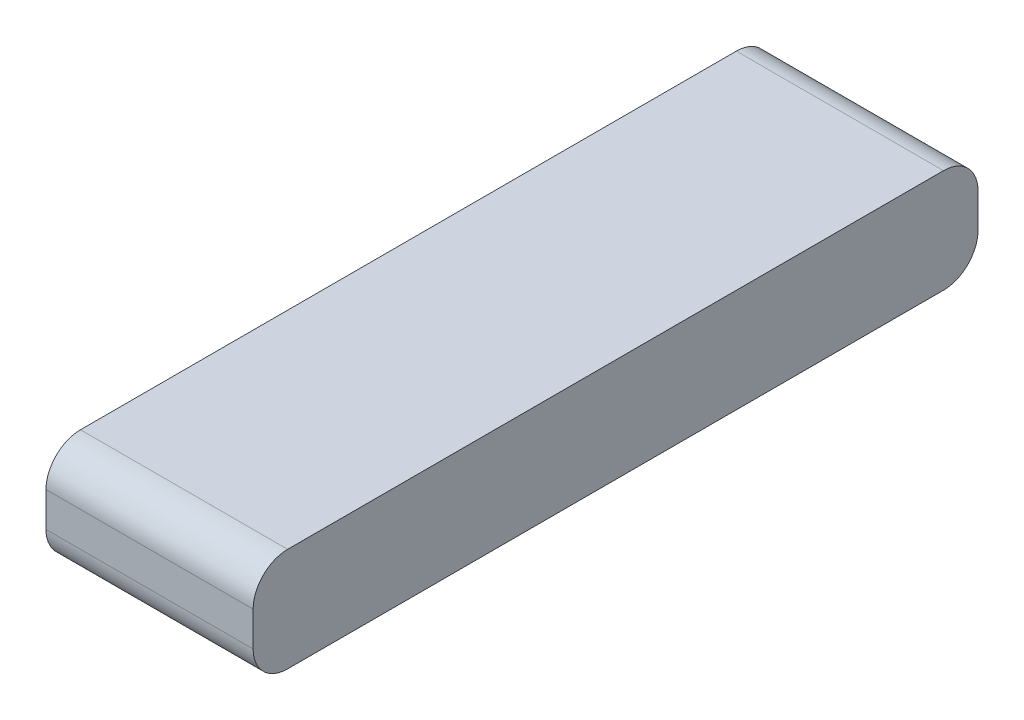
ISO-10303-21;
HEADER;
FILE_DESCRIPTION(('STEP AP214'),'2;1');
FILE_NAME('part.step','',(''),(''),'','','');
FILE_SCHEMA(('AUTOMOTIVE_DESIGN { 1 0 10303 214 1 1 1 1 }'));
ENDSEC;
DATA;
#1=APPLICATION_CONTEXT('core data for automotive mechanical design processes');
#2=APPLICATION_PROTOCOL_DEFINITION('international standard','automotive_design',2000,#1);
#3=PRODUCT_CONTEXT('',#1,'mechanical');
#4=PRODUCT('Part','Part','',(#3));
#5=PRODUCT_RELATED_PRODUCT_CATEGORY('part','',(#4));
#6=PRODUCT_DEFINITION_FORMATION('','',#4);
#7=PRODUCT_DEFINITION_CONTEXT('part definition',#1,'design');
#8=PRODUCT_DEFINITION('design','',#6,#7);
#9=PRODUCT_DEFINITION_SHAPE('','',#8);
#10=(LENGTH_UNIT() NAMED_UNIT(*) SI_UNIT(.MILLI.,.METRE.));
#11=(NAMED_UNIT(*) PLANE_ANGLE_UNIT() SI_UNIT($,.RADIAN.));
#12=(NAMED_UNIT(*) SI_UNIT($,.STERADIAN.) SOLID_ANGLE_UNIT());
#13=UNCERTAINTY_MEASURE_WITH_UNIT(LENGTH_MEASURE(1.E-05),#10,'distance_accuracy_value','');
#14=(GEOMETRIC_REPRESENTATION_CONTEXT(3) GLOBAL_UNCERTAINTY_ASSIGNED_CONTEXT((#13)) GLOBAL_UNIT_ASSIGNED_CONTEXT((#10,
#11,#12)) REPRESENTATION_CONTEXT('',''));
#15=CARTESIAN_POINT('',(0.,0.,0.));
#16=DIRECTION('',(0.,0.,1.));
#17=DIRECTION('',(1.,0.,0.));
#18=AXIS2_PLACEMENT_3D('',#15,#16,#17);
#19=CARTESIAN_POINT('',(0.,19.05,0.));
#20=DIRECTION('',(1.,0.,0.));
#21=DIRECTION('',(0.,0.,-1.));
#22=AXIS2_PLACEMENT_3D('',#19,#20,#21);
#23=PLANE('',#22);
#24=DIRECTION('',(0.,-1.,0.));
#25=VECTOR('',#24,1.);
#26=CARTESIAN_POINT('',(0.,19.05,-133.35));
#27=LINE('',#26,#25);
#28=CARTESIAN_POINT('',(0.,12.7,-133.35));
#29=VERTEX_POINT('',#28);
#30=CARTESIAN_POINT('',(0.,6.35,-133.35));
#31=VERTEX_POINT('',#30);
#32=EDGE_CURVE('E103',#29,#31,#27,.T.);
#33=ORIENTED_EDGE('',*,*,#32,.T.);
#34=CARTESIAN_POINT('',(0.,6.35,-127.));
#35=DIRECTION('',(1.,0.,0.));
#36=DIRECTION('',(0.,0.,-1.));
#37=AXIS2_PLACEMENT_3D('',#34,#35,#36);
#38=CIRCLE('',#37,6.35);
#39=CARTESIAN_POINT('',(0.,0.,-127.));
#40=VERTEX_POINT('',#39);
#41=EDGE_CURVE('E110',#31,#40,#38,.F.);
#42=ORIENTED_EDGE('',*,*,#41,.T.);
#43=DIRECTION('',(0.,0.,1.));
#44=VECTOR('',#43,1.);
#45=CARTESIAN_POINT('',(0.,0.,0.));
#46=LINE('',#45,#44);
#47=CARTESIAN_POINT('',(0.,0.,-6.35));
#48=VERTEX_POINT('',#47);
#49=EDGE_CURVE('E170',#40,#48,#46,.T.);
#50=ORIENTED_EDGE('',*,*,#49,.T.);
#51=CARTESIAN_POINT('',(0.,6.35,-6.35));
#52=DIRECTION('',(1.,0.,0.));
#53=DIRECTION('',(0.,0.,-1.));
#54=AXIS2_PLACEMENT_3D('',#51,#52,#53);
#55=CIRCLE('',#54,6.35);
#56=CARTESIAN_POINT('',(0.,6.35,0.));
#57=VERTEX_POINT('',#56);
#58=EDGE_CURVE('E111',#48,#57,#55,.F.);
#59=ORIENTED_EDGE('',*,*,#58,.T.);
#60=DIRECTION('',(0.,-1.,0.));
#61=VECTOR('',#60,1.);
#62=CARTESIAN_POINT('',(0.,19.05,0.));
#63=LINE('',#62,#61);
#64=CARTESIAN_POINT('',(0.,12.7,0.));
#65=VERTEX_POINT('',#64);
#66=EDGE_CURVE('E127',#65,#57,#63,.T.);
#67=ORIENTED_EDGE('',*,*,#66,.F.);
#68=CARTESIAN_POINT('',(0.,12.7,-6.35));
#69=DIRECTION('',(1.,0.,0.));
#70=DIRECTION('',(0.,0.,-1.));
#71=AXIS2_PLACEMENT_3D('',#68,#69,#70);
#72=CIRCLE('',#71,6.35);
#73=CARTESIAN_POINT('',(0.,19.05,-6.35));
#74=VERTEX_POINT('',#73);
#75=EDGE_CURVE('E129',#65,#74,#72,.F.);
#76=ORIENTED_EDGE('',*,*,#75,.T.);
#77=DIRECTION('',(0.,0.,1.));
#78=VECTOR('',#77,1.);
#79=CARTESIAN_POINT('',(0.,19.05,0.));
#80=LINE('',#79,#78);
#81=CARTESIAN_POINT('',(0.,19.05,-127.));
#82=VERTEX_POINT('',#81);
#83=EDGE_CURVE('E105',#82,#74,#80,.T.);
#84=ORIENTED_EDGE('',*,*,#83,.F.);
#85=CARTESIAN_POINT('',(0.,12.7,-127.));
#86=DIRECTION('',(1.,0.,0.));
#87=DIRECTION('',(0.,0.,-1.));
#88=AXIS2_PLACEMENT_3D('',#85,#86,#87);
#89=CIRCLE('',#88,6.35);
#90=EDGE_CURVE('E101',#82,#29,#89,.F.);
#91=ORIENTED_EDGE('',*,*,#90,.T.);
#92=EDGE_LOOP('',(#33,#42,#50,#59,#67,#76,#84,#91));
#93=FACE_BOUND('',#92,.T.);
#94=ADVANCED_FACE('F35',(#93),#23,.F.);
#95=CARTESIAN_POINT('',(0.,19.05,0.));
#96=DIRECTION('',(0.,0.,-1.));
#97=DIRECTION('',(-1.,0.,0.));
#98=AXIS2_PLACEMENT_3D('',#95,#96,#97);
#99=PLANE('',#98);
#100=ORIENTED_EDGE('',*,*,#66,.T.);
#101=DIRECTION('',(1.,0.,0.));
#102=VECTOR('',#101,1.);
#103=CARTESIAN_POINT('',(38.1,6.35,0.));
#104=LINE('',#103,#102);
#105=CARTESIAN_POINT('',(38.1,6.35,0.));
#106=VERTEX_POINT('',#105);
#107=EDGE_CURVE('E11',#57,#106,#104,.T.);
#108=ORIENTED_EDGE('',*,*,#107,.T.);
#109=DIRECTION('',(0.,-1.,0.));
#110=VECTOR('',#109,1.);
#111=CARTESIAN_POINT('',(38.1,19.05,0.));
#112=LINE('',#111,#110);
#113=CARTESIAN_POINT('',(38.1,12.7,0.));
#114=VERTEX_POINT('',#113);
#115=EDGE_CURVE('E132',#114,#106,#112,.T.);
#116=ORIENTED_EDGE('',*,*,#115,.F.);
#117=DIRECTION('',(1.,0.,0.));
#118=VECTOR('',#117,1.);
#119=CARTESIAN_POINT('',(0.,12.7,0.));
#120=LINE('',#119,#118);
#121=EDGE_CURVE('E43',#114,#65,#120,.F.);
#122=ORIENTED_EDGE('',*,*,#121,.T.);
#123=EDGE_LOOP('',(#100,#108,#116,#122));
#124=FACE_BOUND('',#123,.T.);
#125=ADVANCED_FACE('F155',(#124),#99,.F.);
#126=CARTESIAN_POINT('',(38.1,19.05,0.));
#127=DIRECTION('',(-1.,0.,0.));
#128=DIRECTION('',(0.,0.,1.));
#129=AXIS2_PLACEMENT_3D('',#126,#127,#128);
#130=PLANE('',#129);
#131=DIRECTION('',(0.,0.,-1.));
#132=VECTOR('',#131,1.);
#133=CARTESIAN_POINT('',(38.1,0.,0.));
#134=LINE('',#133,#132);
#135=CARTESIAN_POINT('',(38.1,0.,-6.35));
#136=VERTEX_POINT('',#135);
#137=CARTESIAN_POINT('',(38.1,0.,-127.));
#138=VERTEX_POINT('',#137);
#139=EDGE_CURVE('E167',#136,#138,#134,.T.);
#140=ORIENTED_EDGE('',*,*,#139,.T.);
#141=CARTESIAN_POINT('',(38.1,6.35,-127.));
#142=DIRECTION('',(-1.,0.,0.));
#143=DIRECTION('',(0.,0.,1.));
#144=AXIS2_PLACEMENT_3D('',#141,#142,#143);
#145=CIRCLE('',#144,6.35);
#146=CARTESIAN_POINT('',(38.1,6.35,-133.35));
#147=VERTEX_POINT('',#146);
#148=EDGE_CURVE('E146',#138,#147,#145,.F.);
#149=ORIENTED_EDGE('',*,*,#148,.T.);
#150=DIRECTION('',(0.,-1.,0.));
#151=VECTOR('',#150,1.);
#152=CARTESIAN_POINT('',(38.1,19.05,-133.35));
#153=LINE('',#152,#151);
#154=CARTESIAN_POINT('',(38.1,12.7,-133.35));
#155=VERTEX_POINT('',#154);
#156=EDGE_CURVE('E121',#155,#147,#153,.T.);
#157=ORIENTED_EDGE('',*,*,#156,.F.);
#158=CARTESIAN_POINT('',(38.1,12.7,-127.));
#159=DIRECTION('',(-1.,0.,0.));
#160=DIRECTION('',(0.,0.,1.));
#161=AXIS2_PLACEMENT_3D('',#158,#159,#160);
#162=CIRCLE('',#161,6.35);
#163=CARTESIAN_POINT('',(38.1,19.05,-127.));
#164=VERTEX_POINT('',#163);
#165=EDGE_CURVE('E126',#155,#164,#162,.F.);
#166=ORIENTED_EDGE('',*,*,#165,.T.);
#167=DIRECTION('',(0.,0.,-1.));
#168=VECTOR('',#167,1.);
#169=CARTESIAN_POINT('',(38.1,19.05,0.));
#170=LINE('',#169,#168);
#171=CARTESIAN_POINT('',(38.1,19.05,-6.35));
#172=VERTEX_POINT('',#171);
#173=EDGE_CURVE('E122',#172,#164,#170,.T.);
#174=ORIENTED_EDGE('',*,*,#173,.F.);
#175=CARTESIAN_POINT('',(38.1,12.7,-6.35));
#176=DIRECTION('',(-1.,0.,0.));
#177=DIRECTION('',(0.,0.,1.));
#178=AXIS2_PLACEMENT_3D('',#175,#176,#177);
#179=CIRCLE('',#178,6.35);
#180=EDGE_CURVE('E57',#172,#114,#179,.F.);
#181=ORIENTED_EDGE('',*,*,#180,.T.);
#182=ORIENTED_EDGE('',*,*,#115,.T.);
#183=CARTESIAN_POINT('',(38.1,6.35,-6.35));
#184=DIRECTION('',(-1.,0.,0.));
#185=DIRECTION('',(0.,0.,1.));
#186=AXIS2_PLACEMENT_3D('',#183,#184,#185);
#187=CIRCLE('',#186,6.35);
#188=EDGE_CURVE('E50',#106,#136,#187,.F.);
#189=ORIENTED_EDGE('',*,*,#188,.T.);
#190=EDGE_LOOP('',(#140,#149,#157,#166,#174,#181,#182,#189));
#191=FACE_BOUND('',#190,.T.);
#192=ADVANCED_FACE('F165',(#191),#130,.F.);
#193=CARTESIAN_POINT('',(0.,19.05,-133.35));
#194=DIRECTION('',(0.,0.,1.));
#195=DIRECTION('',(1.,0.,0.));
#196=AXIS2_PLACEMENT_3D('',#193,#194,#195);
#197=PLANE('',#196);
#198=ORIENTED_EDGE('',*,*,#156,.T.);
#199=DIRECTION('',(-1.,0.,0.));
#200=VECTOR('',#199,1.);
#201=CARTESIAN_POINT('',(0.,6.35,-133.35));
#202=LINE('',#201,#200);
#203=EDGE_CURVE('E120',#147,#31,#202,.T.);
#204=ORIENTED_EDGE('',*,*,#203,.T.);
#205=ORIENTED_EDGE('',*,*,#32,.F.);
#206=DIRECTION('',(-1.,0.,0.));
#207=VECTOR('',#206,1.);
#208=CARTESIAN_POINT('',(0.,12.7,-133.35));
#209=LINE('',#208,#207);
#210=EDGE_CURVE('E117',#29,#155,#209,.F.);
#211=ORIENTED_EDGE('',*,*,#210,.T.);
#212=EDGE_LOOP('',(#198,#204,#205,#211));
#213=FACE_BOUND('',#212,.T.);
#214=ADVANCED_FACE('F116',(#213),#197,.F.);
#215=CARTESIAN_POINT('',(0.,19.05,0.));
#216=DIRECTION('',(0.,-1.,0.));
#217=DIRECTION('',(0.,0.,-1.));
#218=AXIS2_PLACEMENT_3D('',#215,#216,#217);
#219=PLANE('',#218);
#220=ORIENTED_EDGE('',*,*,#173,.T.);
#221=DIRECTION('',(-1.,0.,0.));
#222=VECTOR('',#221,1.);
#223=CARTESIAN_POINT('',(0.,19.05,-127.));
#224=LINE('',#223,#222);
#225=EDGE_CURVE('E151',#164,#82,#224,.T.);
#226=ORIENTED_EDGE('',*,*,#225,.T.);
#227=ORIENTED_EDGE('',*,*,#83,.T.);
#228=DIRECTION('',(1.,0.,0.));
#229=VECTOR('',#228,1.);
#230=CARTESIAN_POINT('',(0.,19.05,-6.35));
#231=LINE('',#230,#229);
#232=EDGE_CURVE('E148',#74,#172,#231,.T.);
#233=ORIENTED_EDGE('',*,*,#232,.T.);
#234=EDGE_LOOP('',(#220,#226,#227,#233));
#235=FACE_BOUND('',#234,.T.);
#236=ADVANCED_FACE('F163',(#235),#219,.F.);
#237=CARTESIAN_POINT('',(0.,0.,0.));
#238=DIRECTION('',(0.,-1.,0.));
#239=DIRECTION('',(0.,0.,-1.));
#240=AXIS2_PLACEMENT_3D('',#237,#238,#239);
#241=PLANE('',#240);
#242=ORIENTED_EDGE('',*,*,#49,.F.);
#243=DIRECTION('',(-1.,0.,0.));
#244=VECTOR('',#243,1.);
#245=CARTESIAN_POINT('',(38.1,0.,-127.));
#246=LINE('',#245,#244);
#247=EDGE_CURVE('E141',#40,#138,#246,.F.);
#248=ORIENTED_EDGE('',*,*,#247,.T.);
#249=ORIENTED_EDGE('',*,*,#139,.F.);
#250=DIRECTION('',(1.,0.,0.));
#251=VECTOR('',#250,1.);
#252=CARTESIAN_POINT('',(0.,0.,-6.35));
#253=LINE('',#252,#251);
#254=EDGE_CURVE('E139',#136,#48,#253,.F.);
#255=ORIENTED_EDGE('',*,*,#254,.T.);
#256=EDGE_LOOP('',(#242,#248,#249,#255));
#257=FACE_BOUND('',#256,.T.);
#258=ADVANCED_FACE('F177',(#257),#241,.T.);
#259=CARTESIAN_POINT('',(0.,6.35,-127.));
#260=DIRECTION('',(1.,0.,0.));
#261=DIRECTION('',(0.,0.,-1.));
#262=AXIS2_PLACEMENT_3D('',#259,#260,#261);
#263=CYLINDRICAL_SURFACE('',#262,6.35);
#264=ORIENTED_EDGE('',*,*,#148,.F.);
#265=ORIENTED_EDGE('',*,*,#247,.F.);
#266=ORIENTED_EDGE('',*,*,#41,.F.);
#267=ORIENTED_EDGE('',*,*,#203,.F.);
#268=EDGE_LOOP('',(#264,#265,#266,#267));
#269=FACE_BOUND('',#268,.T.);
#270=ADVANCED_FACE('F185',(#269),#263,.T.);
#271=CARTESIAN_POINT('',(0.,12.7,-127.));
#272=DIRECTION('',(-1.,0.,0.));
#273=DIRECTION('',(0.,0.,1.));
#274=AXIS2_PLACEMENT_3D('',#271,#272,#273);
#275=CYLINDRICAL_SURFACE('',#274,6.35);
#276=ORIENTED_EDGE('',*,*,#165,.F.);
#277=ORIENTED_EDGE('',*,*,#210,.F.);
#278=ORIENTED_EDGE('',*,*,#90,.F.);
#279=ORIENTED_EDGE('',*,*,#225,.F.);
#280=EDGE_LOOP('',(#276,#277,#278,#279));
#281=FACE_BOUND('',#280,.T.);
#282=ADVANCED_FACE('F125',(#281),#275,.T.);
#283=CARTESIAN_POINT('',(0.,6.35,-6.35));
#284=DIRECTION('',(-1.,0.,0.));
#285=DIRECTION('',(0.,0.,1.));
#286=AXIS2_PLACEMENT_3D('',#283,#284,#285);
#287=CYLINDRICAL_SURFACE('',#286,6.35);
#288=ORIENTED_EDGE('',*,*,#58,.F.);
#289=ORIENTED_EDGE('',*,*,#254,.F.);
#290=ORIENTED_EDGE('',*,*,#188,.F.);
#291=ORIENTED_EDGE('',*,*,#107,.F.);
#292=EDGE_LOOP('',(#288,#289,#290,#291));
#293=FACE_BOUND('',#292,.T.);
#294=ADVANCED_FACE('F179',(#293),#287,.T.);
#295=CARTESIAN_POINT('',(0.,12.7,-6.35));
#296=DIRECTION('',(1.,0.,0.));
#297=DIRECTION('',(0.,0.,-1.));
#298=AXIS2_PLACEMENT_3D('',#295,#296,#297);
#299=CYLINDRICAL_SURFACE('',#298,6.35);
#300=ORIENTED_EDGE('',*,*,#75,.F.);
#301=ORIENTED_EDGE('',*,*,#121,.F.);
#302=ORIENTED_EDGE('',*,*,#180,.F.);
#303=ORIENTED_EDGE('',*,*,#232,.F.);
#304=EDGE_LOOP('',(#300,#301,#302,#303));
#305=FACE_BOUND('',#304,.T.);
#306=ADVANCED_FACE('F37',(#305),#299,.T.);
#307=CLOSED_SHELL('',(#94,#125,#192,#214,#236,#258,#270,#282,#294,#306));
#308=MANIFOLD_SOLID_BREP('B2',#307);
#309=ADVANCED_BREP_SHAPE_REPRESENTATION('',(#18,#308),#14);
#310=SHAPE_DEFINITION_REPRESENTATION(#9,#309);
ENDSEC;
END-ISO-10303-21;
